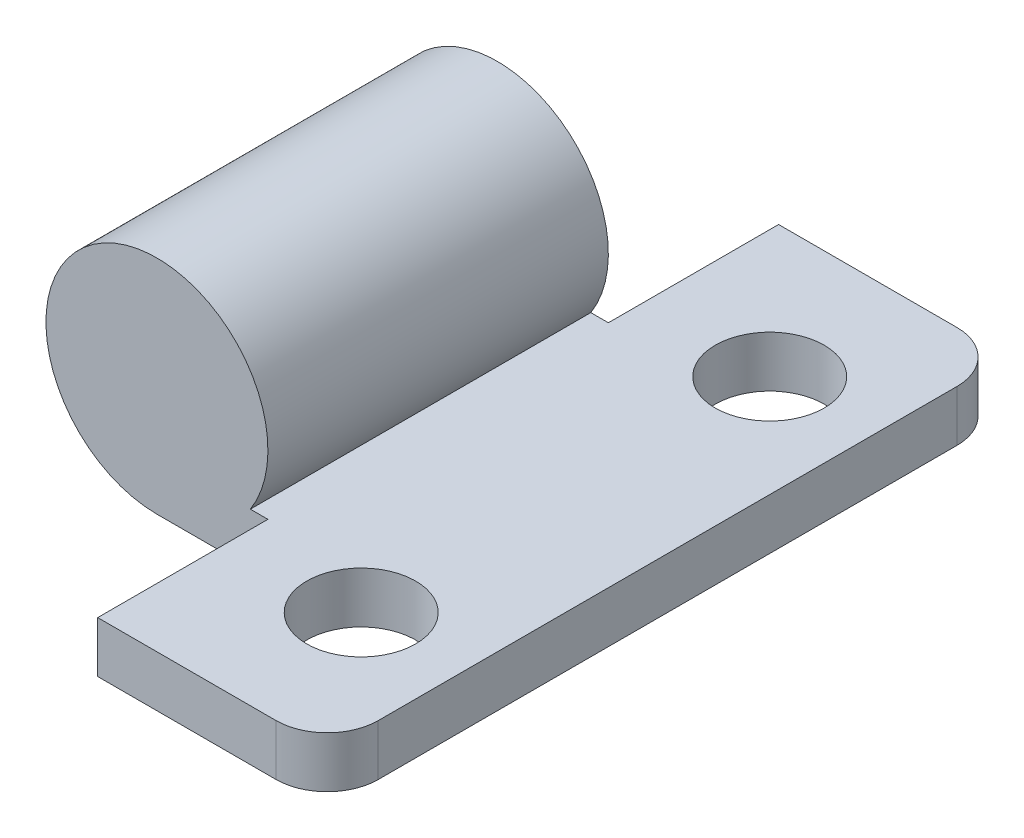
ISO-10303-21;
HEADER;
FILE_DESCRIPTION(('STEP AP214'),'2;1');
FILE_NAME('part.step','',(''),(''),'','','');
FILE_SCHEMA(('AUTOMOTIVE_DESIGN { 1 0 10303 214 1 1 1 1 }'));
ENDSEC;
DATA;
#1=APPLICATION_CONTEXT('core data for automotive mechanical design processes');
#2=APPLICATION_PROTOCOL_DEFINITION('international standard','automotive_design',2000,#1);
#3=PRODUCT_CONTEXT('',#1,'mechanical');
#4=PRODUCT('Part','Part','',(#3));
#5=PRODUCT_RELATED_PRODUCT_CATEGORY('part','',(#4));
#6=PRODUCT_DEFINITION_FORMATION('','',#4);
#7=PRODUCT_DEFINITION_CONTEXT('part definition',#1,'design');
#8=PRODUCT_DEFINITION('design','',#6,#7);
#9=PRODUCT_DEFINITION_SHAPE('','',#8);
#10=(LENGTH_UNIT() NAMED_UNIT(*) SI_UNIT(.MILLI.,.METRE.));
#11=(NAMED_UNIT(*) PLANE_ANGLE_UNIT() SI_UNIT($,.RADIAN.));
#12=(NAMED_UNIT(*) SI_UNIT($,.STERADIAN.) SOLID_ANGLE_UNIT());
#13=UNCERTAINTY_MEASURE_WITH_UNIT(LENGTH_MEASURE(1.E-05),#10,'distance_accuracy_value','');
#14=(GEOMETRIC_REPRESENTATION_CONTEXT(3) GLOBAL_UNCERTAINTY_ASSIGNED_CONTEXT((#13)) GLOBAL_UNIT_ASSIGNED_CONTEXT((#10,
#11,#12)) REPRESENTATION_CONTEXT('',''));
#15=CARTESIAN_POINT('',(0.,0.,0.));
#16=DIRECTION('',(0.,0.,1.));
#17=DIRECTION('',(1.,0.,0.));
#18=AXIS2_PLACEMENT_3D('',#15,#16,#17);
#19=CARTESIAN_POINT('',(0.,0.,10.));
#20=DIRECTION('',(0.,0.,-1.));
#21=DIRECTION('',(-1.,0.,0.));
#22=AXIS2_PLACEMENT_3D('',#19,#20,#21);
#23=CYLINDRICAL_SURFACE('',#22,3.26);
#24=CARTESIAN_POINT('',(0.,0.,-5.));
#25=DIRECTION('',(0.,0.,1.));
#26=DIRECTION('',(1.,0.,0.));
#27=AXIS2_PLACEMENT_3D('',#24,#25,#26);
#28=CIRCLE('',#27,3.26);
#29=CARTESIAN_POINT('',(2.74408454680245,-1.76,-5.));
#30=VERTEX_POINT('',#29);
#31=CARTESIAN_POINT('',(0.,-3.26,-5.));
#32=VERTEX_POINT('',#31);
#33=EDGE_CURVE('E166',#30,#32,#28,.T.);
#34=ORIENTED_EDGE('',*,*,#33,.T.);
#35=DIRECTION('',(0.,0.,-1.));
#36=VECTOR('',#35,1.);
#37=CARTESIAN_POINT('',(0.,-3.26,10.));
#38=LINE('',#37,#36);
#39=CARTESIAN_POINT('',(0.,-3.26,5.));
#40=VERTEX_POINT('',#39);
#41=EDGE_CURVE('E185',#40,#32,#38,.T.);
#42=ORIENTED_EDGE('',*,*,#41,.F.);
#43=CARTESIAN_POINT('',(0.,0.,5.));
#44=DIRECTION('',(0.,0.,-1.));
#45=DIRECTION('',(-1.,0.,0.));
#46=AXIS2_PLACEMENT_3D('',#43,#44,#45);
#47=CIRCLE('',#46,3.26);
#48=CARTESIAN_POINT('',(2.74408454680245,-1.76,5.));
#49=VERTEX_POINT('',#48);
#50=EDGE_CURVE('E134',#40,#49,#47,.T.);
#51=ORIENTED_EDGE('',*,*,#50,.T.);
#52=DIRECTION('',(0.,0.,-1.));
#53=VECTOR('',#52,1.);
#54=CARTESIAN_POINT('',(2.74408454680245,-1.76,10.));
#55=LINE('',#54,#53);
#56=EDGE_CURVE('E173',#49,#30,#55,.T.);
#57=ORIENTED_EDGE('',*,*,#56,.T.);
#58=EDGE_LOOP('',(#34,#42,#51,#57));
#59=FACE_BOUND('',#58,.T.);
#60=ADVANCED_FACE('F36',(#59),#23,.T.);
#61=CARTESIAN_POINT('',(0.,-3.26,10.));
#62=DIRECTION('',(0.,1.,0.));
#63=DIRECTION('',(0.,0.,1.));
#64=AXIS2_PLACEMENT_3D('',#61,#62,#63);
#65=PLANE('',#64);
#66=CARTESIAN_POINT('',(7.,-3.26,6.));
#67=DIRECTION('',(0.,1.,0.));
#68=DIRECTION('',(1.,0.,0.));
#69=AXIS2_PLACEMENT_3D('',#66,#67,#68);
#70=CIRCLE('',#69,1.6);
#71=CARTESIAN_POINT('',(8.6,-3.26,6.));
#72=VERTEX_POINT('',#71);
#73=EDGE_CURVE('E143',#72,#72,#70,.T.);
#74=ORIENTED_EDGE('',*,*,#73,.T.);
#75=EDGE_LOOP('',(#74));
#76=FACE_BOUND('',#75,.T.);
#77=CARTESIAN_POINT('',(7.,-3.26,-6.));
#78=DIRECTION('',(0.,1.,0.));
#79=DIRECTION('',(-1.,0.,0.));
#80=AXIS2_PLACEMENT_3D('',#77,#78,#79);
#81=CIRCLE('',#80,1.6);
#82=CARTESIAN_POINT('',(5.4,-3.26,-6.));
#83=VERTEX_POINT('',#82);
#84=EDGE_CURVE('E146',#83,#83,#81,.T.);
#85=ORIENTED_EDGE('',*,*,#84,.T.);
#86=EDGE_LOOP('',(#85));
#87=FACE_BOUND('',#86,.T.);
#88=DIRECTION('',(1.,0.,0.));
#89=VECTOR('',#88,1.);
#90=CARTESIAN_POINT('',(0.,-3.26,-10.));
#91=LINE('',#90,#89);
#92=CARTESIAN_POINT('',(3.26,-3.26,-10.));
#93=VERTEX_POINT('',#92);
#94=CARTESIAN_POINT('',(8.5,-3.26,-10.));
#95=VERTEX_POINT('',#94);
#96=EDGE_CURVE('E174',#93,#95,#91,.T.);
#97=ORIENTED_EDGE('',*,*,#96,.T.);
#98=CARTESIAN_POINT('',(8.5,-3.26,-8.5));
#99=DIRECTION('',(0.,1.,0.));
#100=DIRECTION('',(0.,0.,1.));
#101=AXIS2_PLACEMENT_3D('',#98,#99,#100);
#102=CIRCLE('',#101,1.5);
#103=CARTESIAN_POINT('',(10.,-3.26,-8.5));
#104=VERTEX_POINT('',#103);
#105=EDGE_CURVE('E44',#95,#104,#102,.F.);
#106=ORIENTED_EDGE('',*,*,#105,.T.);
#107=DIRECTION('',(0.,0.,-1.));
#108=VECTOR('',#107,1.);
#109=CARTESIAN_POINT('',(10.,-3.26,10.));
#110=LINE('',#109,#108);
#111=CARTESIAN_POINT('',(10.,-3.26,8.5));
#112=VERTEX_POINT('',#111);
#113=EDGE_CURVE('E182',#112,#104,#110,.T.);
#114=ORIENTED_EDGE('',*,*,#113,.F.);
#115=CARTESIAN_POINT('',(8.5,-3.26,8.5));
#116=DIRECTION('',(0.,1.,0.));
#117=DIRECTION('',(0.,0.,1.));
#118=AXIS2_PLACEMENT_3D('',#115,#116,#117);
#119=CIRCLE('',#118,1.5);
#120=CARTESIAN_POINT('',(8.5,-3.26,10.));
#121=VERTEX_POINT('',#120);
#122=EDGE_CURVE('E51',#112,#121,#119,.F.);
#123=ORIENTED_EDGE('',*,*,#122,.T.);
#124=DIRECTION('',(1.,0.,0.));
#125=VECTOR('',#124,1.);
#126=CARTESIAN_POINT('',(0.,-3.26,10.));
#127=LINE('',#126,#125);
#128=CARTESIAN_POINT('',(3.26,-3.26,10.));
#129=VERTEX_POINT('',#128);
#130=EDGE_CURVE('E139',#129,#121,#127,.T.);
#131=ORIENTED_EDGE('',*,*,#130,.F.);
#132=DIRECTION('',(0.,0.,-1.));
#133=VECTOR('',#132,1.);
#134=CARTESIAN_POINT('',(3.26,-3.26,10.));
#135=LINE('',#134,#133);
#136=CARTESIAN_POINT('',(3.26,-3.26,5.));
#137=VERTEX_POINT('',#136);
#138=EDGE_CURVE('E121',#129,#137,#135,.T.);
#139=ORIENTED_EDGE('',*,*,#138,.T.);
#140=DIRECTION('',(-1.,0.,0.));
#141=VECTOR('',#140,1.);
#142=CARTESIAN_POINT('',(-3.26,-3.26,5.));
#143=LINE('',#142,#141);
#144=EDGE_CURVE('E132',#137,#40,#143,.T.);
#145=ORIENTED_EDGE('',*,*,#144,.T.);
#146=ORIENTED_EDGE('',*,*,#41,.T.);
#147=DIRECTION('',(1.,0.,0.));
#148=VECTOR('',#147,1.);
#149=CARTESIAN_POINT('',(-3.26,-3.26,-5.));
#150=LINE('',#149,#148);
#151=CARTESIAN_POINT('',(3.26,-3.26,-5.));
#152=VERTEX_POINT('',#151);
#153=EDGE_CURVE('E128',#32,#152,#150,.T.);
#154=ORIENTED_EDGE('',*,*,#153,.T.);
#155=DIRECTION('',(0.,0.,-1.));
#156=VECTOR('',#155,1.);
#157=CARTESIAN_POINT('',(3.26,-3.26,-10.));
#158=LINE('',#157,#156);
#159=EDGE_CURVE('E150',#152,#93,#158,.T.);
#160=ORIENTED_EDGE('',*,*,#159,.T.);
#161=EDGE_LOOP('',(#97,#106,#114,#123,#131,#139,#145,#146,#154,#160));
#162=FACE_BOUND('',#161,.T.);
#163=ADVANCED_FACE('F138',(#76,#87,#162),#65,.F.);
#164=CARTESIAN_POINT('',(10.,-3.26,10.));
#165=DIRECTION('',(-1.,0.,0.));
#166=DIRECTION('',(0.,0.,1.));
#167=AXIS2_PLACEMENT_3D('',#164,#165,#166);
#168=PLANE('',#167);
#169=ORIENTED_EDGE('',*,*,#113,.T.);
#170=DIRECTION('',(0.,1.,0.));
#171=VECTOR('',#170,1.);
#172=CARTESIAN_POINT('',(10.,-3.26,-8.5));
#173=LINE('',#172,#171);
#174=CARTESIAN_POINT('',(10.,-1.76,-8.5));
#175=VERTEX_POINT('',#174);
#176=EDGE_CURVE('E198',#104,#175,#173,.T.);
#177=ORIENTED_EDGE('',*,*,#176,.T.);
#178=DIRECTION('',(0.,0.,-1.));
#179=VECTOR('',#178,1.);
#180=CARTESIAN_POINT('',(10.,-1.76,10.));
#181=LINE('',#180,#179);
#182=CARTESIAN_POINT('',(10.,-1.76,8.5));
#183=VERTEX_POINT('',#182);
#184=EDGE_CURVE('E179',#183,#175,#181,.T.);
#185=ORIENTED_EDGE('',*,*,#184,.F.);
#186=DIRECTION('',(0.,1.,0.));
#187=VECTOR('',#186,1.);
#188=CARTESIAN_POINT('',(10.,-3.26,8.5));
#189=LINE('',#188,#187);
#190=EDGE_CURVE('E194',#183,#112,#189,.F.);
#191=ORIENTED_EDGE('',*,*,#190,.T.);
#192=EDGE_LOOP('',(#169,#177,#185,#191));
#193=FACE_BOUND('',#192,.T.);
#194=ADVANCED_FACE('F210',(#193),#168,.F.);
#195=CARTESIAN_POINT('',(10.,-1.76,10.));
#196=DIRECTION('',(0.,-1.,0.));
#197=DIRECTION('',(1.,0.,0.));
#198=AXIS2_PLACEMENT_3D('',#195,#196,#197);
#199=PLANE('',#198);
#200=CARTESIAN_POINT('',(7.,-1.76,6.));
#201=DIRECTION('',(0.,-1.,0.));
#202=DIRECTION('',(1.,0.,0.));
#203=AXIS2_PLACEMENT_3D('',#200,#201,#202);
#204=CIRCLE('',#203,1.6);
#205=CARTESIAN_POINT('',(8.6,-1.76,6.));
#206=VERTEX_POINT('',#205);
#207=EDGE_CURVE('E168',#206,#206,#204,.T.);
#208=ORIENTED_EDGE('',*,*,#207,.T.);
#209=EDGE_LOOP('',(#208));
#210=FACE_BOUND('',#209,.T.);
#211=CARTESIAN_POINT('',(7.,-1.76,-6.));
#212=DIRECTION('',(0.,-1.,0.));
#213=DIRECTION('',(1.,0.,0.));
#214=AXIS2_PLACEMENT_3D('',#211,#212,#213);
#215=CIRCLE('',#214,1.6);
#216=CARTESIAN_POINT('',(8.6,-1.76,-6.));
#217=VERTEX_POINT('',#216);
#218=EDGE_CURVE('E164',#217,#217,#215,.T.);
#219=ORIENTED_EDGE('',*,*,#218,.T.);
#220=EDGE_LOOP('',(#219));
#221=FACE_BOUND('',#220,.T.);
#222=ORIENTED_EDGE('',*,*,#184,.T.);
#223=CARTESIAN_POINT('',(8.5,-1.76,-8.5));
#224=DIRECTION('',(0.,-1.,0.));
#225=DIRECTION('',(1.,0.,0.));
#226=AXIS2_PLACEMENT_3D('',#223,#224,#225);
#227=CIRCLE('',#226,1.5);
#228=CARTESIAN_POINT('',(8.5,-1.76,-10.));
#229=VERTEX_POINT('',#228);
#230=EDGE_CURVE('E203',#175,#229,#227,.F.);
#231=ORIENTED_EDGE('',*,*,#230,.T.);
#232=DIRECTION('',(-1.,0.,0.));
#233=VECTOR('',#232,1.);
#234=CARTESIAN_POINT('',(10.,-1.76,-10.));
#235=LINE('',#234,#233);
#236=CARTESIAN_POINT('',(3.26,-1.76,-10.));
#237=VERTEX_POINT('',#236);
#238=EDGE_CURVE('E171',#229,#237,#235,.T.);
#239=ORIENTED_EDGE('',*,*,#238,.T.);
#240=DIRECTION('',(0.,0.,1.));
#241=VECTOR('',#240,1.);
#242=CARTESIAN_POINT('',(3.26,-1.76,10.));
#243=LINE('',#242,#241);
#244=CARTESIAN_POINT('',(3.26,-1.76,-5.));
#245=VERTEX_POINT('',#244);
#246=EDGE_CURVE('E160',#237,#245,#243,.T.);
#247=ORIENTED_EDGE('',*,*,#246,.T.);
#248=DIRECTION('',(-1.,0.,0.));
#249=VECTOR('',#248,1.);
#250=CARTESIAN_POINT('',(10.,-1.76,-5.));
#251=LINE('',#250,#249);
#252=EDGE_CURVE('E191',#245,#30,#251,.T.);
#253=ORIENTED_EDGE('',*,*,#252,.T.);
#254=ORIENTED_EDGE('',*,*,#56,.F.);
#255=DIRECTION('',(1.,0.,0.));
#256=VECTOR('',#255,1.);
#257=CARTESIAN_POINT('',(10.,-1.76,5.));
#258=LINE('',#257,#256);
#259=CARTESIAN_POINT('',(3.26,-1.76,5.));
#260=VERTEX_POINT('',#259);
#261=EDGE_CURVE('E187',#49,#260,#258,.T.);
#262=ORIENTED_EDGE('',*,*,#261,.T.);
#263=DIRECTION('',(0.,0.,1.));
#264=VECTOR('',#263,1.);
#265=CARTESIAN_POINT('',(3.26,-1.76,10.));
#266=LINE('',#265,#264);
#267=CARTESIAN_POINT('',(3.26,-1.76,10.));
#268=VERTEX_POINT('',#267);
#269=EDGE_CURVE('E124',#260,#268,#266,.T.);
#270=ORIENTED_EDGE('',*,*,#269,.T.);
#271=DIRECTION('',(-1.,0.,0.));
#272=VECTOR('',#271,1.);
#273=CARTESIAN_POINT('',(10.,-1.76,10.));
#274=LINE('',#273,#272);
#275=CARTESIAN_POINT('',(8.5,-1.76,10.));
#276=VERTEX_POINT('',#275);
#277=EDGE_CURVE('E170',#276,#268,#274,.T.);
#278=ORIENTED_EDGE('',*,*,#277,.F.);
#279=CARTESIAN_POINT('',(8.5,-1.76,8.5));
#280=DIRECTION('',(0.,-1.,0.));
#281=DIRECTION('',(1.,0.,0.));
#282=AXIS2_PLACEMENT_3D('',#279,#280,#281);
#283=CIRCLE('',#282,1.5);
#284=EDGE_CURVE('E201',#276,#183,#283,.F.);
#285=ORIENTED_EDGE('',*,*,#284,.T.);
#286=EDGE_LOOP('',(#222,#231,#239,#247,#253,#254,#262,#270,#278,#285));
#287=FACE_BOUND('',#286,.T.);
#288=ADVANCED_FACE('F215',(#210,#221,#287),#199,.F.);
#289=CARTESIAN_POINT('',(0.,0.,10.));
#290=DIRECTION('',(0.,0.,1.));
#291=DIRECTION('',(1.,0.,0.));
#292=AXIS2_PLACEMENT_3D('',#289,#290,#291);
#293=PLANE('',#292);
#294=ORIENTED_EDGE('',*,*,#130,.T.);
#295=DIRECTION('',(0.,1.,0.));
#296=VECTOR('',#295,1.);
#297=CARTESIAN_POINT('',(8.5,-1.76,10.));
#298=LINE('',#297,#296);
#299=EDGE_CURVE('E11',#121,#276,#298,.T.);
#300=ORIENTED_EDGE('',*,*,#299,.T.);
#301=ORIENTED_EDGE('',*,*,#277,.T.);
#302=DIRECTION('',(0.,1.,0.));
#303=VECTOR('',#302,1.);
#304=CARTESIAN_POINT('',(3.26,-3.26,10.));
#305=LINE('',#304,#303);
#306=EDGE_CURVE('E129',#129,#268,#305,.T.);
#307=ORIENTED_EDGE('',*,*,#306,.F.);
#308=EDGE_LOOP('',(#294,#300,#301,#307));
#309=FACE_BOUND('',#308,.T.);
#310=ADVANCED_FACE('F228',(#309),#293,.T.);
#311=CARTESIAN_POINT('',(0.,0.,-10.));
#312=DIRECTION('',(0.,0.,1.));
#313=DIRECTION('',(1.,0.,0.));
#314=AXIS2_PLACEMENT_3D('',#311,#312,#313);
#315=PLANE('',#314);
#316=ORIENTED_EDGE('',*,*,#238,.F.);
#317=DIRECTION('',(0.,1.,0.));
#318=VECTOR('',#317,1.);
#319=CARTESIAN_POINT('',(8.5,0.,-10.));
#320=LINE('',#319,#318);
#321=EDGE_CURVE('E59',#229,#95,#320,.F.);
#322=ORIENTED_EDGE('',*,*,#321,.T.);
#323=ORIENTED_EDGE('',*,*,#96,.F.);
#324=DIRECTION('',(0.,1.,0.));
#325=VECTOR('',#324,1.);
#326=CARTESIAN_POINT('',(3.26,-3.26,-10.));
#327=LINE('',#326,#325);
#328=EDGE_CURVE('E147',#93,#237,#327,.T.);
#329=ORIENTED_EDGE('',*,*,#328,.T.);
#330=EDGE_LOOP('',(#316,#322,#323,#329));
#331=FACE_BOUND('',#330,.T.);
#332=ADVANCED_FACE('F217',(#331),#315,.F.);
#333=CARTESIAN_POINT('',(-3.26,-3.26,-5.));
#334=DIRECTION('',(0.,0.,1.));
#335=DIRECTION('',(1.,0.,0.));
#336=AXIS2_PLACEMENT_3D('',#333,#334,#335);
#337=PLANE('',#336);
#338=ORIENTED_EDGE('',*,*,#33,.F.);
#339=ORIENTED_EDGE('',*,*,#252,.F.);
#340=DIRECTION('',(0.,1.,0.));
#341=VECTOR('',#340,1.);
#342=CARTESIAN_POINT('',(3.26,-3.26,-5.));
#343=LINE('',#342,#341);
#344=EDGE_CURVE('E153',#152,#245,#343,.T.);
#345=ORIENTED_EDGE('',*,*,#344,.F.);
#346=ORIENTED_EDGE('',*,*,#153,.F.);
#347=EDGE_LOOP('',(#338,#339,#345,#346));
#348=FACE_BOUND('',#347,.T.);
#349=ADVANCED_FACE('F223',(#348),#337,.F.);
#350=CARTESIAN_POINT('',(3.26,-3.26,-10.));
#351=DIRECTION('',(1.,0.,0.));
#352=DIRECTION('',(0.,1.,0.));
#353=AXIS2_PLACEMENT_3D('',#350,#351,#352);
#354=PLANE('',#353);
#355=ORIENTED_EDGE('',*,*,#328,.F.);
#356=ORIENTED_EDGE('',*,*,#159,.F.);
#357=ORIENTED_EDGE('',*,*,#344,.T.);
#358=ORIENTED_EDGE('',*,*,#246,.F.);
#359=EDGE_LOOP('',(#355,#356,#357,#358));
#360=FACE_BOUND('',#359,.T.);
#361=ADVANCED_FACE('F220',(#360),#354,.F.);
#362=CARTESIAN_POINT('',(-3.26,-3.26,5.));
#363=DIRECTION('',(0.,0.,-1.));
#364=DIRECTION('',(-1.,0.,0.));
#365=AXIS2_PLACEMENT_3D('',#362,#363,#364);
#366=PLANE('',#365);
#367=ORIENTED_EDGE('',*,*,#144,.F.);
#368=DIRECTION('',(0.,1.,0.));
#369=VECTOR('',#368,1.);
#370=CARTESIAN_POINT('',(3.26,-3.26,5.));
#371=LINE('',#370,#369);
#372=EDGE_CURVE('E116',#137,#260,#371,.T.);
#373=ORIENTED_EDGE('',*,*,#372,.T.);
#374=ORIENTED_EDGE('',*,*,#261,.F.);
#375=ORIENTED_EDGE('',*,*,#50,.F.);
#376=EDGE_LOOP('',(#367,#373,#374,#375));
#377=FACE_BOUND('',#376,.T.);
#378=ADVANCED_FACE('F133',(#377),#366,.F.);
#379=CARTESIAN_POINT('',(3.26,-3.26,10.));
#380=DIRECTION('',(1.,0.,0.));
#381=DIRECTION('',(0.,1.,0.));
#382=AXIS2_PLACEMENT_3D('',#379,#380,#381);
#383=PLANE('',#382);
#384=ORIENTED_EDGE('',*,*,#372,.F.);
#385=ORIENTED_EDGE('',*,*,#138,.F.);
#386=ORIENTED_EDGE('',*,*,#306,.T.);
#387=ORIENTED_EDGE('',*,*,#269,.F.);
#388=EDGE_LOOP('',(#384,#385,#386,#387));
#389=FACE_BOUND('',#388,.T.);
#390=ADVANCED_FACE('F118',(#389),#383,.F.);
#391=CARTESIAN_POINT('',(7.,-3.26,-6.));
#392=DIRECTION('',(0.,1.,0.));
#393=DIRECTION('',(-1.,0.,0.));
#394=AXIS2_PLACEMENT_3D('',#391,#392,#393);
#395=CYLINDRICAL_SURFACE('',#394,1.6);
#396=ORIENTED_EDGE('',*,*,#84,.F.);
#397=EDGE_LOOP('',(#396));
#398=FACE_BOUND('',#397,.T.);
#399=ORIENTED_EDGE('',*,*,#218,.F.);
#400=EDGE_LOOP('',(#399));
#401=FACE_BOUND('',#400,.T.);
#402=ADVANCED_FACE('F253',(#398,#401),#395,.F.);
#403=CARTESIAN_POINT('',(7.,-3.26,6.));
#404=DIRECTION('',(0.,1.,0.));
#405=DIRECTION('',(-1.,0.,0.));
#406=AXIS2_PLACEMENT_3D('',#403,#404,#405);
#407=CYLINDRICAL_SURFACE('',#406,1.6);
#408=ORIENTED_EDGE('',*,*,#73,.F.);
#409=EDGE_LOOP('',(#408));
#410=FACE_BOUND('',#409,.T.);
#411=ORIENTED_EDGE('',*,*,#207,.F.);
#412=EDGE_LOOP('',(#411));
#413=FACE_BOUND('',#412,.T.);
#414=ADVANCED_FACE('F235',(#410,#413),#407,.F.);
#415=CARTESIAN_POINT('',(8.5,-3.26,-8.5));
#416=DIRECTION('',(0.,1.,0.));
#417=DIRECTION('',(0.,0.,1.));
#418=AXIS2_PLACEMENT_3D('',#415,#416,#417);
#419=CYLINDRICAL_SURFACE('',#418,1.5);
#420=ORIENTED_EDGE('',*,*,#105,.F.);
#421=ORIENTED_EDGE('',*,*,#321,.F.);
#422=ORIENTED_EDGE('',*,*,#230,.F.);
#423=ORIENTED_EDGE('',*,*,#176,.F.);
#424=EDGE_LOOP('',(#420,#421,#422,#423));
#425=FACE_BOUND('',#424,.T.);
#426=ADVANCED_FACE('F213',(#425),#419,.T.);
#427=CARTESIAN_POINT('',(8.5,0.,8.5));
#428=DIRECTION('',(0.,-1.,0.));
#429=DIRECTION('',(0.,0.,-1.));
#430=AXIS2_PLACEMENT_3D('',#427,#428,#429);
#431=CYLINDRICAL_SURFACE('',#430,1.5);
#432=ORIENTED_EDGE('',*,*,#122,.F.);
#433=ORIENTED_EDGE('',*,*,#190,.F.);
#434=ORIENTED_EDGE('',*,*,#284,.F.);
#435=ORIENTED_EDGE('',*,*,#299,.F.);
#436=EDGE_LOOP('',(#432,#433,#434,#435));
#437=FACE_BOUND('',#436,.T.);
#438=ADVANCED_FACE('F38',(#437),#431,.T.);
#439=CLOSED_SHELL('',(#60,#163,#194,#288,#310,#332,#349,#361,#378,#390,#402,#414,#426,#438));
#440=MANIFOLD_SOLID_BREP('B2',#439);
#441=ADVANCED_BREP_SHAPE_REPRESENTATION('',(#18,#440),#14);
#442=SHAPE_DEFINITION_REPRESENTATION(#9,#441);
ENDSEC;
END-ISO-10303-21;
